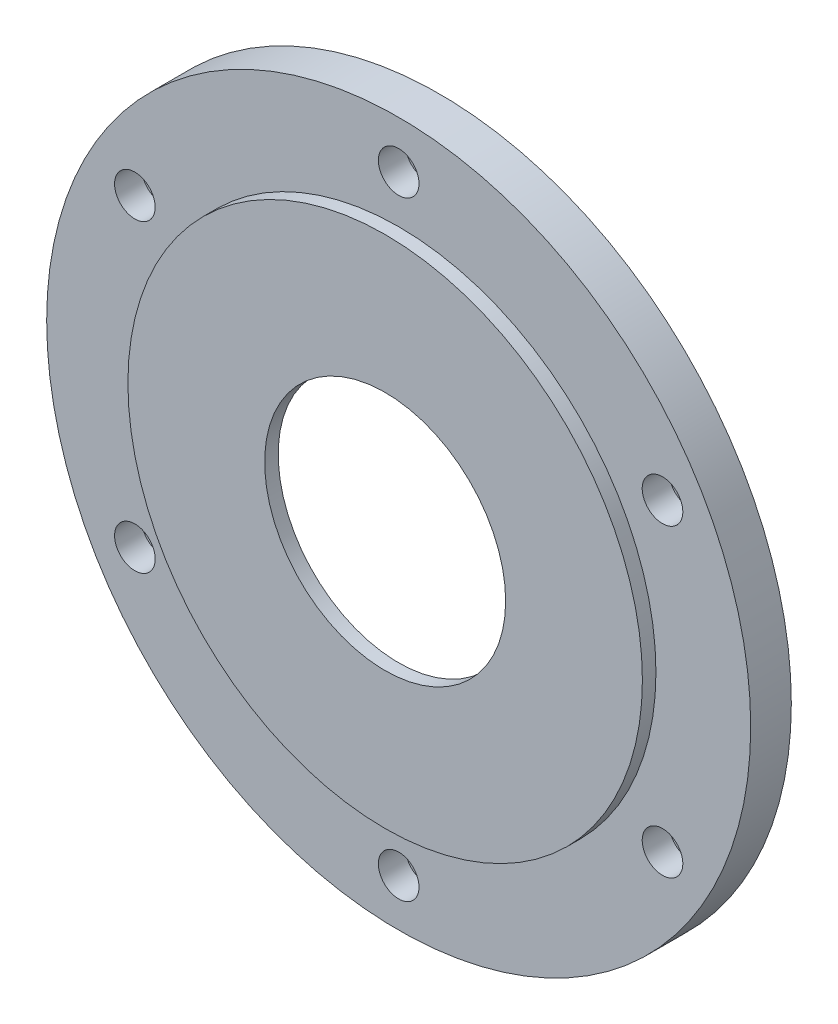
ISO-10303-21;
HEADER;
FILE_DESCRIPTION(('STEP AP214'),'2;1');
FILE_NAME('part.step','',(''),(''),'','','');
FILE_SCHEMA(('AUTOMOTIVE_DESIGN { 1 0 10303 214 1 1 1 1 }'));
ENDSEC;
DATA;
#1=APPLICATION_CONTEXT('core data for automotive mechanical design processes');
#2=APPLICATION_PROTOCOL_DEFINITION('international standard','automotive_design',2000,#1);
#3=PRODUCT_CONTEXT('',#1,'mechanical');
#4=PRODUCT('Part','Part','',(#3));
#5=PRODUCT_RELATED_PRODUCT_CATEGORY('part','',(#4));
#6=PRODUCT_DEFINITION_FORMATION('','',#4);
#7=PRODUCT_DEFINITION_CONTEXT('part definition',#1,'design');
#8=PRODUCT_DEFINITION('design','',#6,#7);
#9=PRODUCT_DEFINITION_SHAPE('','',#8);
#10=(LENGTH_UNIT() NAMED_UNIT(*) SI_UNIT(.MILLI.,.METRE.));
#11=(NAMED_UNIT(*) PLANE_ANGLE_UNIT() SI_UNIT($,.RADIAN.));
#12=(NAMED_UNIT(*) SI_UNIT($,.STERADIAN.) SOLID_ANGLE_UNIT());
#13=UNCERTAINTY_MEASURE_WITH_UNIT(LENGTH_MEASURE(1.E-05),#10,'distance_accuracy_value','');
#14=(GEOMETRIC_REPRESENTATION_CONTEXT(3) GLOBAL_UNCERTAINTY_ASSIGNED_CONTEXT((#13)) GLOBAL_UNIT_ASSIGNED_CONTEXT((#10,
#11,#12)) REPRESENTATION_CONTEXT('',''));
#15=CARTESIAN_POINT('',(0.,0.,0.));
#16=DIRECTION('',(0.,0.,1.));
#17=DIRECTION('',(1.,0.,0.));
#18=AXIS2_PLACEMENT_3D('',#15,#16,#17);
#19=CARTESIAN_POINT('',(0.,0.,-3.));
#20=DIRECTION('',(0.,0.,-1.));
#21=DIRECTION('',(-1.,0.,0.));
#22=AXIS2_PLACEMENT_3D('',#19,#20,#21);
#23=PLANE('',#22);
#24=CARTESIAN_POINT('',(0.,0.,-3.));
#25=DIRECTION('',(0.,0.,-1.));
#26=DIRECTION('',(-1.,0.,0.));
#27=AXIS2_PLACEMENT_3D('',#24,#25,#26);
#28=CIRCLE('',#27,26.);
#29=CARTESIAN_POINT('',(-26.,0.,-3.));
#30=VERTEX_POINT('',#29);
#31=EDGE_CURVE('E11',#30,#30,#28,.T.);
#32=ORIENTED_EDGE('',*,*,#31,.T.);
#33=EDGE_LOOP('',(#32));
#34=FACE_BOUND('',#33,.T.);
#35=CARTESIAN_POINT('',(0.,0.,-3.));
#36=DIRECTION('',(0.,0.,-1.));
#37=DIRECTION('',(-1.,0.,0.));
#38=AXIS2_PLACEMENT_3D('',#35,#36,#37);
#39=CIRCLE('',#38,19.);
#40=CARTESIAN_POINT('',(-19.,0.,-3.));
#41=VERTEX_POINT('',#40);
#42=EDGE_CURVE('E53',#41,#41,#39,.T.);
#43=ORIENTED_EDGE('',*,*,#42,.F.);
#44=EDGE_LOOP('',(#43));
#45=FACE_BOUND('',#44,.T.);
#46=ADVANCED_FACE('F42',(#34,#45),#23,.T.);
#47=CARTESIAN_POINT('',(0.,0.,0.));
#48=DIRECTION('',(0.,0.,-1.));
#49=DIRECTION('',(-1.,0.,0.));
#50=AXIS2_PLACEMENT_3D('',#47,#48,#49);
#51=PLANE('',#50);
#52=CARTESIAN_POINT('',(0.,22.5,0.));
#53=DIRECTION('',(0.,0.,1.));
#54=DIRECTION('',(1.,0.,0.));
#55=AXIS2_PLACEMENT_3D('',#52,#53,#54);
#56=CIRCLE('',#55,1.5);
#57=CARTESIAN_POINT('',(1.5,22.5,0.));
#58=VERTEX_POINT('',#57);
#59=EDGE_CURVE('E86',#58,#58,#56,.T.);
#60=ORIENTED_EDGE('',*,*,#59,.F.);
#61=EDGE_LOOP('',(#60));
#62=FACE_BOUND('',#61,.T.);
#63=CARTESIAN_POINT('',(-19.4855715851494,11.2499999999992,0.));
#64=DIRECTION('',(0.,0.,1.));
#65=DIRECTION('',(1.,0.,0.));
#66=AXIS2_PLACEMENT_3D('',#63,#64,#65);
#67=CIRCLE('',#66,1.5);
#68=CARTESIAN_POINT('',(-17.9855715851494,11.2499999999992,0.));
#69=VERTEX_POINT('',#68);
#70=EDGE_CURVE('E87',#69,#69,#67,.T.);
#71=ORIENTED_EDGE('',*,*,#70,.F.);
#72=EDGE_LOOP('',(#71));
#73=FACE_BOUND('',#72,.T.);
#74=CARTESIAN_POINT('',(-19.4855715851484,-11.2500000000008,0.));
#75=DIRECTION('',(0.,0.,1.));
#76=DIRECTION('',(1.,0.,0.));
#77=AXIS2_PLACEMENT_3D('',#74,#75,#76);
#78=CIRCLE('',#77,1.5);
#79=CARTESIAN_POINT('',(-17.9855715851484,-11.2500000000008,0.));
#80=VERTEX_POINT('',#79);
#81=EDGE_CURVE('E61',#80,#80,#78,.T.);
#82=ORIENTED_EDGE('',*,*,#81,.F.);
#83=EDGE_LOOP('',(#82));
#84=FACE_BOUND('',#83,.T.);
#85=CARTESIAN_POINT('',(1.9099540912982E-12,-22.5,0.));
#86=DIRECTION('',(0.,0.,1.));
#87=DIRECTION('',(1.,0.,0.));
#88=AXIS2_PLACEMENT_3D('',#85,#86,#87);
#89=CIRCLE('',#88,1.5);
#90=CARTESIAN_POINT('',(1.50000000000191,-22.5,0.));
#91=VERTEX_POINT('',#90);
#92=EDGE_CURVE('E68',#91,#91,#89,.T.);
#93=ORIENTED_EDGE('',*,*,#92,.F.);
#94=EDGE_LOOP('',(#93));
#95=FACE_BOUND('',#94,.T.);
#96=CARTESIAN_POINT('',(19.4855715851513,-11.2499999999992,0.));
#97=DIRECTION('',(0.,0.,1.));
#98=DIRECTION('',(1.,0.,0.));
#99=AXIS2_PLACEMENT_3D('',#96,#97,#98);
#100=CIRCLE('',#99,1.5);
#101=CARTESIAN_POINT('',(20.9855715851513,-11.2499999999992,0.));
#102=VERTEX_POINT('',#101);
#103=EDGE_CURVE('E74',#102,#102,#100,.T.);
#104=ORIENTED_EDGE('',*,*,#103,.F.);
#105=EDGE_LOOP('',(#104));
#106=FACE_BOUND('',#105,.T.);
#107=CARTESIAN_POINT('',(19.4855715851503,11.2500000000008,0.));
#108=DIRECTION('',(0.,0.,1.));
#109=DIRECTION('',(1.,0.,0.));
#110=AXIS2_PLACEMENT_3D('',#107,#108,#109);
#111=CIRCLE('',#110,1.5);
#112=CARTESIAN_POINT('',(20.9855715851503,11.2500000000008,0.));
#113=VERTEX_POINT('',#112);
#114=EDGE_CURVE('E80',#113,#113,#111,.T.);
#115=ORIENTED_EDGE('',*,*,#114,.F.);
#116=EDGE_LOOP('',(#115));
#117=FACE_BOUND('',#116,.T.);
#118=CARTESIAN_POINT('',(0.,0.,0.));
#119=DIRECTION('',(0.,0.,-1.));
#120=DIRECTION('',(-1.,0.,0.));
#121=AXIS2_PLACEMENT_3D('',#118,#119,#120);
#122=CIRCLE('',#121,26.);
#123=CARTESIAN_POINT('',(-26.,0.,0.));
#124=VERTEX_POINT('',#123);
#125=EDGE_CURVE('E46',#124,#124,#122,.T.);
#126=ORIENTED_EDGE('',*,*,#125,.F.);
#127=EDGE_LOOP('',(#126));
#128=FACE_BOUND('',#127,.T.);
#129=CARTESIAN_POINT('',(0.,0.,0.));
#130=DIRECTION('',(0.,0.,-1.));
#131=DIRECTION('',(-1.,0.,0.));
#132=AXIS2_PLACEMENT_3D('',#129,#130,#131);
#133=CIRCLE('',#132,19.);
#134=CARTESIAN_POINT('',(-19.,0.,0.));
#135=VERTEX_POINT('',#134);
#136=EDGE_CURVE('E55',#135,#135,#133,.T.);
#137=ORIENTED_EDGE('',*,*,#136,.T.);
#138=EDGE_LOOP('',(#137));
#139=FACE_BOUND('',#138,.T.);
#140=ADVANCED_FACE('F106',(#62,#73,#84,#95,#106,#117,#128,#139),#51,.F.);
#141=CARTESIAN_POINT('',(0.,0.,-3.));
#142=DIRECTION('',(0.,0.,1.));
#143=DIRECTION('',(1.,0.,0.));
#144=AXIS2_PLACEMENT_3D('',#141,#142,#143);
#145=CYLINDRICAL_SURFACE('',#144,26.);
#146=ORIENTED_EDGE('',*,*,#31,.F.);
#147=EDGE_LOOP('',(#146));
#148=FACE_BOUND('',#147,.T.);
#149=ORIENTED_EDGE('',*,*,#125,.T.);
#150=EDGE_LOOP('',(#149));
#151=FACE_BOUND('',#150,.T.);
#152=ADVANCED_FACE('F44',(#148,#151),#145,.T.);
#153=CARTESIAN_POINT('',(0.,0.,-3.));
#154=DIRECTION('',(0.,0.,1.));
#155=DIRECTION('',(1.,0.,0.));
#156=AXIS2_PLACEMENT_3D('',#153,#154,#155);
#157=CYLINDRICAL_SURFACE('',#156,19.);
#158=ORIENTED_EDGE('',*,*,#42,.T.);
#159=EDGE_LOOP('',(#158));
#160=FACE_BOUND('',#159,.T.);
#161=ORIENTED_EDGE('',*,*,#136,.F.);
#162=EDGE_LOOP('',(#161));
#163=FACE_BOUND('',#162,.T.);
#164=ADVANCED_FACE('F123',(#160,#163),#157,.F.);
#165=CARTESIAN_POINT('',(19.4855715851503,11.2500000000008,-2.));
#166=DIRECTION('',(0.,0.,1.));
#167=DIRECTION('',(1.,0.,0.));
#168=AXIS2_PLACEMENT_3D('',#165,#166,#167);
#169=CYLINDRICAL_SURFACE('',#168,1.5);
#170=CARTESIAN_POINT('',(19.4855715851503,11.2500000000008,-2.));
#171=DIRECTION('',(0.,0.,1.));
#172=DIRECTION('',(1.,0.,0.));
#173=AXIS2_PLACEMENT_3D('',#170,#171,#172);
#174=CIRCLE('',#173,1.5);
#175=CARTESIAN_POINT('',(20.9855715851503,11.2500000000008,-2.));
#176=VERTEX_POINT('',#175);
#177=EDGE_CURVE('E83',#176,#176,#174,.T.);
#178=ORIENTED_EDGE('',*,*,#177,.F.);
#179=EDGE_LOOP('',(#178));
#180=FACE_BOUND('',#179,.T.);
#181=ORIENTED_EDGE('',*,*,#114,.T.);
#182=EDGE_LOOP('',(#181));
#183=FACE_BOUND('',#182,.T.);
#184=ADVANCED_FACE('F125',(#180,#183),#169,.F.);
#185=CARTESIAN_POINT('',(19.4855715851503,11.2500000000008,-2.));
#186=DIRECTION('',(0.,0.,1.));
#187=DIRECTION('',(1.,0.,0.));
#188=AXIS2_PLACEMENT_3D('',#185,#186,#187);
#189=PLANE('',#188);
#190=ORIENTED_EDGE('',*,*,#177,.T.);
#191=EDGE_LOOP('',(#190));
#192=FACE_BOUND('',#191,.T.);
#193=ADVANCED_FACE('F132',(#192),#189,.T.);
#194=CARTESIAN_POINT('',(19.4855715851513,-11.2499999999992,-2.));
#195=DIRECTION('',(0.,0.,1.));
#196=DIRECTION('',(1.,0.,0.));
#197=AXIS2_PLACEMENT_3D('',#194,#195,#196);
#198=CYLINDRICAL_SURFACE('',#197,1.5);
#199=CARTESIAN_POINT('',(19.4855715851513,-11.2499999999992,-2.));
#200=DIRECTION('',(0.,0.,1.));
#201=DIRECTION('',(1.,0.,0.));
#202=AXIS2_PLACEMENT_3D('',#199,#200,#201);
#203=CIRCLE('',#202,1.5);
#204=CARTESIAN_POINT('',(20.9855715851513,-11.2499999999992,-2.));
#205=VERTEX_POINT('',#204);
#206=EDGE_CURVE('E77',#205,#205,#203,.T.);
#207=ORIENTED_EDGE('',*,*,#206,.F.);
#208=EDGE_LOOP('',(#207));
#209=FACE_BOUND('',#208,.T.);
#210=ORIENTED_EDGE('',*,*,#103,.T.);
#211=EDGE_LOOP('',(#210));
#212=FACE_BOUND('',#211,.T.);
#213=ADVANCED_FACE('F170',(#209,#212),#198,.F.);
#214=CARTESIAN_POINT('',(19.4855715851513,-11.2499999999992,-2.));
#215=DIRECTION('',(0.,0.,1.));
#216=DIRECTION('',(1.,0.,0.));
#217=AXIS2_PLACEMENT_3D('',#214,#215,#216);
#218=PLANE('',#217);
#219=ORIENTED_EDGE('',*,*,#206,.T.);
#220=EDGE_LOOP('',(#219));
#221=FACE_BOUND('',#220,.T.);
#222=ADVANCED_FACE('F179',(#221),#218,.T.);
#223=CARTESIAN_POINT('',(1.9099540912982E-12,-22.5,-2.));
#224=DIRECTION('',(0.,0.,1.));
#225=DIRECTION('',(1.,0.,0.));
#226=AXIS2_PLACEMENT_3D('',#223,#224,#225);
#227=CYLINDRICAL_SURFACE('',#226,1.5);
#228=CARTESIAN_POINT('',(1.9099540912982E-12,-22.5,-2.));
#229=DIRECTION('',(0.,0.,1.));
#230=DIRECTION('',(1.,0.,0.));
#231=AXIS2_PLACEMENT_3D('',#228,#229,#230);
#232=CIRCLE('',#231,1.5);
#233=CARTESIAN_POINT('',(1.50000000000191,-22.5,-2.));
#234=VERTEX_POINT('',#233);
#235=EDGE_CURVE('E71',#234,#234,#232,.T.);
#236=ORIENTED_EDGE('',*,*,#235,.F.);
#237=EDGE_LOOP('',(#236));
#238=FACE_BOUND('',#237,.T.);
#239=ORIENTED_EDGE('',*,*,#92,.T.);
#240=EDGE_LOOP('',(#239));
#241=FACE_BOUND('',#240,.T.);
#242=ADVANCED_FACE('F188',(#238,#241),#227,.F.);
#243=CARTESIAN_POINT('',(1.9099540912982E-12,-22.5,-2.));
#244=DIRECTION('',(0.,0.,1.));
#245=DIRECTION('',(1.,0.,0.));
#246=AXIS2_PLACEMENT_3D('',#243,#244,#245);
#247=PLANE('',#246);
#248=ORIENTED_EDGE('',*,*,#235,.T.);
#249=EDGE_LOOP('',(#248));
#250=FACE_BOUND('',#249,.T.);
#251=ADVANCED_FACE('F197',(#250),#247,.T.);
#252=CARTESIAN_POINT('',(-19.4855715851484,-11.2500000000008,-2.));
#253=DIRECTION('',(0.,0.,1.));
#254=DIRECTION('',(1.,0.,0.));
#255=AXIS2_PLACEMENT_3D('',#252,#253,#254);
#256=CYLINDRICAL_SURFACE('',#255,1.5);
#257=CARTESIAN_POINT('',(-19.4855715851484,-11.2500000000008,-2.));
#258=DIRECTION('',(0.,0.,1.));
#259=DIRECTION('',(1.,0.,0.));
#260=AXIS2_PLACEMENT_3D('',#257,#258,#259);
#261=CIRCLE('',#260,1.5);
#262=CARTESIAN_POINT('',(-17.9855715851484,-11.2500000000008,-2.));
#263=VERTEX_POINT('',#262);
#264=EDGE_CURVE('E64',#263,#263,#261,.T.);
#265=ORIENTED_EDGE('',*,*,#264,.F.);
#266=EDGE_LOOP('',(#265));
#267=FACE_BOUND('',#266,.T.);
#268=ORIENTED_EDGE('',*,*,#81,.T.);
#269=EDGE_LOOP('',(#268));
#270=FACE_BOUND('',#269,.T.);
#271=ADVANCED_FACE('F206',(#267,#270),#256,.F.);
#272=CARTESIAN_POINT('',(-19.4855715851484,-11.2500000000008,-2.));
#273=DIRECTION('',(0.,0.,1.));
#274=DIRECTION('',(1.,0.,0.));
#275=AXIS2_PLACEMENT_3D('',#272,#273,#274);
#276=PLANE('',#275);
#277=ORIENTED_EDGE('',*,*,#264,.T.);
#278=EDGE_LOOP('',(#277));
#279=FACE_BOUND('',#278,.T.);
#280=ADVANCED_FACE('F215',(#279),#276,.T.);
#281=CARTESIAN_POINT('',(-19.4855715851494,11.2499999999992,-2.));
#282=DIRECTION('',(0.,0.,1.));
#283=DIRECTION('',(1.,0.,0.));
#284=AXIS2_PLACEMENT_3D('',#281,#282,#283);
#285=CYLINDRICAL_SURFACE('',#284,1.5);
#286=CARTESIAN_POINT('',(-19.4855715851494,11.2499999999992,-2.));
#287=DIRECTION('',(0.,0.,1.));
#288=DIRECTION('',(1.,0.,0.));
#289=AXIS2_PLACEMENT_3D('',#286,#287,#288);
#290=CIRCLE('',#289,1.5);
#291=CARTESIAN_POINT('',(-17.9855715851494,11.2499999999992,-2.));
#292=VERTEX_POINT('',#291);
#293=EDGE_CURVE('E65',#292,#292,#290,.T.);
#294=ORIENTED_EDGE('',*,*,#293,.F.);
#295=EDGE_LOOP('',(#294));
#296=FACE_BOUND('',#295,.T.);
#297=ORIENTED_EDGE('',*,*,#70,.T.);
#298=EDGE_LOOP('',(#297));
#299=FACE_BOUND('',#298,.T.);
#300=ADVANCED_FACE('F223',(#296,#299),#285,.F.);
#301=CARTESIAN_POINT('',(-19.4855715851494,11.2499999999992,-2.));
#302=DIRECTION('',(0.,0.,1.));
#303=DIRECTION('',(1.,0.,0.));
#304=AXIS2_PLACEMENT_3D('',#301,#302,#303);
#305=PLANE('',#304);
#306=ORIENTED_EDGE('',*,*,#293,.T.);
#307=EDGE_LOOP('',(#306));
#308=FACE_BOUND('',#307,.T.);
#309=ADVANCED_FACE('F102',(#308),#305,.T.);
#310=CARTESIAN_POINT('',(0.,22.5,-2.));
#311=DIRECTION('',(0.,0.,1.));
#312=DIRECTION('',(1.,0.,0.));
#313=AXIS2_PLACEMENT_3D('',#310,#311,#312);
#314=CYLINDRICAL_SURFACE('',#313,1.5);
#315=CARTESIAN_POINT('',(0.,22.5,-2.));
#316=DIRECTION('',(0.,0.,1.));
#317=DIRECTION('',(1.,0.,0.));
#318=AXIS2_PLACEMENT_3D('',#315,#316,#317);
#319=CIRCLE('',#318,1.5);
#320=CARTESIAN_POINT('',(1.5,22.5,-2.));
#321=VERTEX_POINT('',#320);
#322=EDGE_CURVE('E58',#321,#321,#319,.T.);
#323=ORIENTED_EDGE('',*,*,#322,.F.);
#324=EDGE_LOOP('',(#323));
#325=FACE_BOUND('',#324,.T.);
#326=ORIENTED_EDGE('',*,*,#59,.T.);
#327=EDGE_LOOP('',(#326));
#328=FACE_BOUND('',#327,.T.);
#329=ADVANCED_FACE('F99',(#325,#328),#314,.F.);
#330=CARTESIAN_POINT('',(0.,22.5,-2.));
#331=DIRECTION('',(0.,0.,1.));
#332=DIRECTION('',(1.,0.,0.));
#333=AXIS2_PLACEMENT_3D('',#330,#331,#332);
#334=PLANE('',#333);
#335=ORIENTED_EDGE('',*,*,#322,.T.);
#336=EDGE_LOOP('',(#335));
#337=FACE_BOUND('',#336,.T.);
#338=ADVANCED_FACE('F97',(#337),#334,.T.);
#339=CLOSED_SHELL('',(#46,#140,#152,#164,#184,#193,#213,#222,#242,#251,#271,#280,#300,#309,#329,#338));
#340=MANIFOLD_SOLID_BREP('B2',#339);
#341=CARTESIAN_POINT('',(0.,0.,1.));
#342=DIRECTION('',(0.,0.,1.));
#343=DIRECTION('',(1.,0.,0.));
#344=AXIS2_PLACEMENT_3D('',#341,#342,#343);
#345=PLANE('',#344);
#346=CARTESIAN_POINT('',(0.,0.,1.));
#347=DIRECTION('',(0.,0.,1.));
#348=DIRECTION('',(1.,0.,0.));
#349=AXIS2_PLACEMENT_3D('',#346,#347,#348);
#350=CIRCLE('',#349,19.);
#351=CARTESIAN_POINT('',(19.,0.,1.));
#352=VERTEX_POINT('',#351);
#353=EDGE_CURVE('E41',#352,#352,#350,.T.);
#354=ORIENTED_EDGE('',*,*,#353,.T.);
#355=EDGE_LOOP('',(#354));
#356=FACE_BOUND('',#355,.T.);
#357=CARTESIAN_POINT('',(0.,0.,1.));
#358=DIRECTION('',(0.,0.,1.));
#359=DIRECTION('',(1.,0.,0.));
#360=AXIS2_PLACEMENT_3D('',#357,#358,#359);
#361=CIRCLE('',#360,8.9);
#362=CARTESIAN_POINT('',(8.9,0.,1.));
#363=VERTEX_POINT('',#362);
#364=EDGE_CURVE('E294',#363,#363,#361,.T.);
#365=ORIENTED_EDGE('',*,*,#364,.F.);
#366=EDGE_LOOP('',(#365));
#367=FACE_BOUND('',#366,.T.);
#368=ADVANCED_FACE('F283',(#356,#367),#345,.T.);
#369=CARTESIAN_POINT('',(0.,0.,0.));
#370=DIRECTION('',(0.,0.,1.));
#371=DIRECTION('',(1.,0.,0.));
#372=AXIS2_PLACEMENT_3D('',#369,#370,#371);
#373=PLANE('',#372);
#374=CARTESIAN_POINT('',(0.,0.,0.));
#375=DIRECTION('',(0.,0.,1.));
#376=DIRECTION('',(1.,0.,0.));
#377=AXIS2_PLACEMENT_3D('',#374,#375,#376);
#378=CIRCLE('',#377,19.);
#379=CARTESIAN_POINT('',(19.,0.,0.));
#380=VERTEX_POINT('',#379);
#381=EDGE_CURVE('E287',#380,#380,#378,.T.);
#382=ORIENTED_EDGE('',*,*,#381,.F.);
#383=EDGE_LOOP('',(#382));
#384=FACE_BOUND('',#383,.T.);
#385=CARTESIAN_POINT('',(0.,0.,0.));
#386=DIRECTION('',(0.,0.,1.));
#387=DIRECTION('',(1.,0.,0.));
#388=AXIS2_PLACEMENT_3D('',#385,#386,#387);
#389=CIRCLE('',#388,8.9);
#390=CARTESIAN_POINT('',(8.9,0.,0.));
#391=VERTEX_POINT('',#390);
#392=EDGE_CURVE('E296',#391,#391,#389,.T.);
#393=ORIENTED_EDGE('',*,*,#392,.T.);
#394=EDGE_LOOP('',(#393));
#395=FACE_BOUND('',#394,.T.);
#396=ADVANCED_FACE('F306',(#384,#395),#373,.F.);
#397=CARTESIAN_POINT('',(0.,0.,1.));
#398=DIRECTION('',(0.,0.,-1.));
#399=DIRECTION('',(-1.,0.,0.));
#400=AXIS2_PLACEMENT_3D('',#397,#398,#399);
#401=CYLINDRICAL_SURFACE('',#400,19.);
#402=ORIENTED_EDGE('',*,*,#353,.F.);
#403=EDGE_LOOP('',(#402));
#404=FACE_BOUND('',#403,.T.);
#405=ORIENTED_EDGE('',*,*,#381,.T.);
#406=EDGE_LOOP('',(#405));
#407=FACE_BOUND('',#406,.T.);
#408=ADVANCED_FACE('F285',(#404,#407),#401,.T.);
#409=CARTESIAN_POINT('',(0.,0.,1.));
#410=DIRECTION('',(0.,0.,-1.));
#411=DIRECTION('',(-1.,0.,0.));
#412=AXIS2_PLACEMENT_3D('',#409,#410,#411);
#413=CYLINDRICAL_SURFACE('',#412,8.9);
#414=ORIENTED_EDGE('',*,*,#364,.T.);
#415=EDGE_LOOP('',(#414));
#416=FACE_BOUND('',#415,.T.);
#417=ORIENTED_EDGE('',*,*,#392,.F.);
#418=EDGE_LOOP('',(#417));
#419=FACE_BOUND('',#418,.T.);
#420=ADVANCED_FACE('F302',(#416,#419),#413,.F.);
#421=CLOSED_SHELL('',(#368,#396,#408,#420));
#422=MANIFOLD_SOLID_BREP('B6',#421);
#423=ADVANCED_BREP_SHAPE_REPRESENTATION('',(#18,#340,#422),#14);
#424=SHAPE_DEFINITION_REPRESENTATION(#9,#423);
ENDSEC;
END-ISO-10303-21;
